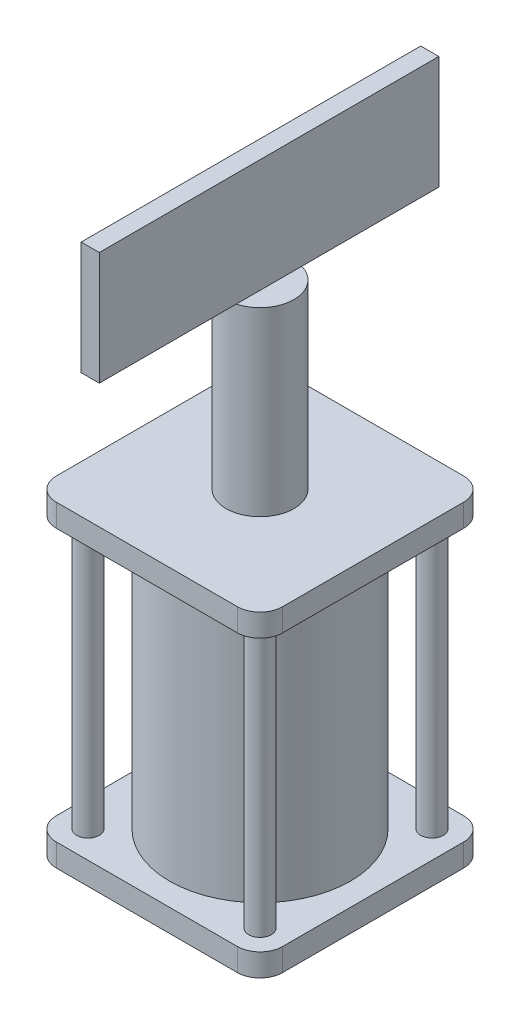
ISO-10303-21;
HEADER;
FILE_DESCRIPTION(('STEP AP214'),'2;1');
FILE_NAME('part.step','',(''),(''),'','','');
FILE_SCHEMA(('AUTOMOTIVE_DESIGN { 1 0 10303 214 1 1 1 1 }'));
ENDSEC;
DATA;
#1=APPLICATION_CONTEXT('core data for automotive mechanical design processes');
#2=APPLICATION_PROTOCOL_DEFINITION('international standard','automotive_design',2000,#1);
#3=PRODUCT_CONTEXT('',#1,'mechanical');
#4=PRODUCT('Part','Part','',(#3));
#5=PRODUCT_RELATED_PRODUCT_CATEGORY('part','',(#4));
#6=PRODUCT_DEFINITION_FORMATION('','',#4);
#7=PRODUCT_DEFINITION_CONTEXT('part definition',#1,'design');
#8=PRODUCT_DEFINITION('design','',#6,#7);
#9=PRODUCT_DEFINITION_SHAPE('','',#8);
#10=(LENGTH_UNIT() NAMED_UNIT(*) SI_UNIT(.MILLI.,.METRE.));
#11=(NAMED_UNIT(*) PLANE_ANGLE_UNIT() SI_UNIT($,.RADIAN.));
#12=(NAMED_UNIT(*) SI_UNIT($,.STERADIAN.) SOLID_ANGLE_UNIT());
#13=UNCERTAINTY_MEASURE_WITH_UNIT(LENGTH_MEASURE(1.E-05),#10,'distance_accuracy_value','');
#14=(GEOMETRIC_REPRESENTATION_CONTEXT(3) GLOBAL_UNCERTAINTY_ASSIGNED_CONTEXT((#13)) GLOBAL_UNIT_ASSIGNED_CONTEXT((#10,
#11,#12)) REPRESENTATION_CONTEXT('',''));
#15=CARTESIAN_POINT('',(0.,0.,0.));
#16=DIRECTION('',(0.,0.,1.));
#17=DIRECTION('',(1.,0.,0.));
#18=AXIS2_PLACEMENT_3D('',#15,#16,#17);
#19=CARTESIAN_POINT('',(4.,270.,75.));
#20=DIRECTION('',(-1.,0.,0.));
#21=DIRECTION('',(0.,0.,1.));
#22=AXIS2_PLACEMENT_3D('',#19,#20,#21);
#23=PLANE('',#22);
#24=DIRECTION('',(0.,0.,-1.));
#25=VECTOR('',#24,1.);
#26=CARTESIAN_POINT('',(4.,220.,75.));
#27=LINE('',#26,#25);
#28=CARTESIAN_POINT('',(4.,220.,75.));
#29=VERTEX_POINT('',#28);
#30=CARTESIAN_POINT('',(4.,220.,-75.));
#31=VERTEX_POINT('',#30);
#32=EDGE_CURVE('E108',#29,#31,#27,.T.);
#33=ORIENTED_EDGE('',*,*,#32,.T.);
#34=DIRECTION('',(0.,-1.,0.));
#35=VECTOR('',#34,1.);
#36=CARTESIAN_POINT('',(4.,270.,-75.));
#37=LINE('',#36,#35);
#38=CARTESIAN_POINT('',(4.,270.,-75.));
#39=VERTEX_POINT('',#38);
#40=EDGE_CURVE('E12',#39,#31,#37,.T.);
#41=ORIENTED_EDGE('',*,*,#40,.F.);
#42=DIRECTION('',(0.,0.,-1.));
#43=VECTOR('',#42,1.);
#44=CARTESIAN_POINT('',(4.,270.,75.));
#45=LINE('',#44,#43);
#46=CARTESIAN_POINT('',(4.,270.,75.));
#47=VERTEX_POINT('',#46);
#48=EDGE_CURVE('E96',#47,#39,#45,.T.);
#49=ORIENTED_EDGE('',*,*,#48,.F.);
#50=DIRECTION('',(0.,-1.,0.));
#51=VECTOR('',#50,1.);
#52=CARTESIAN_POINT('',(4.,270.,75.));
#53=LINE('',#52,#51);
#54=EDGE_CURVE('E104',#47,#29,#53,.T.);
#55=ORIENTED_EDGE('',*,*,#54,.T.);
#56=EDGE_LOOP('',(#33,#41,#49,#55));
#57=FACE_BOUND('',#56,.T.);
#58=ADVANCED_FACE('F45',(#57),#23,.F.);
#59=CARTESIAN_POINT('',(-4.,270.,-75.));
#60=DIRECTION('',(0.,0.,1.));
#61=DIRECTION('',(1.,0.,0.));
#62=AXIS2_PLACEMENT_3D('',#59,#60,#61);
#63=PLANE('',#62);
#64=DIRECTION('',(-1.,0.,0.));
#65=VECTOR('',#64,1.);
#66=CARTESIAN_POINT('',(-4.,220.,-75.));
#67=LINE('',#66,#65);
#68=CARTESIAN_POINT('',(-4.,220.,-75.));
#69=VERTEX_POINT('',#68);
#70=EDGE_CURVE('E100',#31,#69,#67,.T.);
#71=ORIENTED_EDGE('',*,*,#70,.T.);
#72=DIRECTION('',(0.,-1.,0.));
#73=VECTOR('',#72,1.);
#74=CARTESIAN_POINT('',(-4.,270.,-75.));
#75=LINE('',#74,#73);
#76=CARTESIAN_POINT('',(-4.,270.,-75.));
#77=VERTEX_POINT('',#76);
#78=EDGE_CURVE('E53',#77,#69,#75,.T.);
#79=ORIENTED_EDGE('',*,*,#78,.F.);
#80=DIRECTION('',(-1.,0.,0.));
#81=VECTOR('',#80,1.);
#82=CARTESIAN_POINT('',(-4.,270.,-75.));
#83=LINE('',#82,#81);
#84=EDGE_CURVE('E91',#39,#77,#83,.T.);
#85=ORIENTED_EDGE('',*,*,#84,.F.);
#86=ORIENTED_EDGE('',*,*,#40,.T.);
#87=EDGE_LOOP('',(#71,#79,#85,#86));
#88=FACE_BOUND('',#87,.T.);
#89=ADVANCED_FACE('F99',(#88),#63,.F.);
#90=CARTESIAN_POINT('',(-4.,270.,75.));
#91=DIRECTION('',(1.,0.,0.));
#92=DIRECTION('',(0.,0.,-1.));
#93=AXIS2_PLACEMENT_3D('',#90,#91,#92);
#94=PLANE('',#93);
#95=DIRECTION('',(0.,0.,1.));
#96=VECTOR('',#95,1.);
#97=CARTESIAN_POINT('',(-4.,220.,75.));
#98=LINE('',#97,#96);
#99=CARTESIAN_POINT('',(-4.,220.,75.));
#100=VERTEX_POINT('',#99);
#101=EDGE_CURVE('E78',#69,#100,#98,.T.);
#102=ORIENTED_EDGE('',*,*,#101,.T.);
#103=DIRECTION('',(0.,-1.,0.));
#104=VECTOR('',#103,1.);
#105=CARTESIAN_POINT('',(-4.,270.,75.));
#106=LINE('',#105,#104);
#107=CARTESIAN_POINT('',(-4.,270.,75.));
#108=VERTEX_POINT('',#107);
#109=EDGE_CURVE('E101',#108,#100,#106,.T.);
#110=ORIENTED_EDGE('',*,*,#109,.F.);
#111=DIRECTION('',(0.,0.,1.));
#112=VECTOR('',#111,1.);
#113=CARTESIAN_POINT('',(-4.,270.,75.));
#114=LINE('',#113,#112);
#115=EDGE_CURVE('E94',#77,#108,#114,.T.);
#116=ORIENTED_EDGE('',*,*,#115,.F.);
#117=ORIENTED_EDGE('',*,*,#78,.T.);
#118=EDGE_LOOP('',(#102,#110,#116,#117));
#119=FACE_BOUND('',#118,.T.);
#120=ADVANCED_FACE('F102',(#119),#94,.F.);
#121=CARTESIAN_POINT('',(-4.,270.,75.));
#122=DIRECTION('',(0.,0.,-1.));
#123=DIRECTION('',(-1.,0.,0.));
#124=AXIS2_PLACEMENT_3D('',#121,#122,#123);
#125=PLANE('',#124);
#126=DIRECTION('',(1.,0.,0.));
#127=VECTOR('',#126,1.);
#128=CARTESIAN_POINT('',(-4.,220.,75.));
#129=LINE('',#128,#127);
#130=EDGE_CURVE('E84',#100,#29,#129,.T.);
#131=ORIENTED_EDGE('',*,*,#130,.T.);
#132=ORIENTED_EDGE('',*,*,#54,.F.);
#133=DIRECTION('',(1.,0.,0.));
#134=VECTOR('',#133,1.);
#135=CARTESIAN_POINT('',(-4.,270.,75.));
#136=LINE('',#135,#134);
#137=EDGE_CURVE('E61',#108,#47,#136,.T.);
#138=ORIENTED_EDGE('',*,*,#137,.F.);
#139=ORIENTED_EDGE('',*,*,#109,.T.);
#140=EDGE_LOOP('',(#131,#132,#138,#139));
#141=FACE_BOUND('',#140,.T.);
#142=ADVANCED_FACE('F115',(#141),#125,.F.);
#143=CARTESIAN_POINT('',(0.,270.,0.));
#144=DIRECTION('',(0.,-1.,0.));
#145=DIRECTION('',(0.,0.,-1.));
#146=AXIS2_PLACEMENT_3D('',#143,#144,#145);
#147=PLANE('',#146);
#148=ORIENTED_EDGE('',*,*,#48,.T.);
#149=ORIENTED_EDGE('',*,*,#84,.T.);
#150=ORIENTED_EDGE('',*,*,#115,.T.);
#151=ORIENTED_EDGE('',*,*,#137,.T.);
#152=EDGE_LOOP('',(#148,#149,#150,#151));
#153=FACE_BOUND('',#152,.T.);
#154=ADVANCED_FACE('F92',(#153),#147,.F.);
#155=CARTESIAN_POINT('',(0.,220.,0.));
#156=DIRECTION('',(0.,-1.,0.));
#157=DIRECTION('',(0.,0.,-1.));
#158=AXIS2_PLACEMENT_3D('',#155,#156,#157);
#159=PLANE('',#158);
#160=ORIENTED_EDGE('',*,*,#32,.F.);
#161=ORIENTED_EDGE('',*,*,#130,.F.);
#162=ORIENTED_EDGE('',*,*,#101,.F.);
#163=ORIENTED_EDGE('',*,*,#70,.F.);
#164=EDGE_LOOP('',(#160,#161,#162,#163));
#165=FACE_BOUND('',#164,.T.);
#166=ADVANCED_FACE('F118',(#165),#159,.T.);
#167=CLOSED_SHELL('',(#58,#89,#120,#142,#154,#166));
#168=MANIFOLD_SOLID_BREP('B2',#167);
#169=CARTESIAN_POINT('',(0.,220.,0.));
#170=DIRECTION('',(0.,-1.,0.));
#171=DIRECTION('',(0.,0.,-1.));
#172=AXIS2_PLACEMENT_3D('',#169,#170,#171);
#173=CYLINDRICAL_SURFACE('',#172,15.);
#174=CARTESIAN_POINT('',(0.,220.,0.));
#175=DIRECTION('',(0.,1.,0.));
#176=DIRECTION('',(0.,0.,1.));
#177=AXIS2_PLACEMENT_3D('',#174,#175,#176);
#178=CIRCLE('',#177,15.);
#179=CARTESIAN_POINT('',(0.,220.,15.));
#180=VERTEX_POINT('',#179);
#181=EDGE_CURVE('E44',#180,#180,#178,.T.);
#182=ORIENTED_EDGE('',*,*,#181,.F.);
#183=EDGE_LOOP('',(#182));
#184=FACE_BOUND('',#183,.T.);
#185=CARTESIAN_POINT('',(0.,140.,0.));
#186=DIRECTION('',(0.,1.,0.));
#187=DIRECTION('',(0.,0.,1.));
#188=AXIS2_PLACEMENT_3D('',#185,#186,#187);
#189=CIRCLE('',#188,15.);
#190=CARTESIAN_POINT('',(0.,140.,15.));
#191=VERTEX_POINT('',#190);
#192=EDGE_CURVE('E180',#191,#191,#189,.T.);
#193=ORIENTED_EDGE('',*,*,#192,.T.);
#194=EDGE_LOOP('',(#193));
#195=FACE_BOUND('',#194,.T.);
#196=ADVANCED_FACE('F177',(#184,#195),#173,.T.);
#197=CARTESIAN_POINT('',(0.,220.,0.));
#198=DIRECTION('',(0.,1.,0.));
#199=DIRECTION('',(0.,0.,1.));
#200=AXIS2_PLACEMENT_3D('',#197,#198,#199);
#201=PLANE('',#200);
#202=ORIENTED_EDGE('',*,*,#181,.T.);
#203=EDGE_LOOP('',(#202));
#204=FACE_BOUND('',#203,.T.);
#205=ADVANCED_FACE('F192',(#204),#201,.T.);
#206=CARTESIAN_POINT('',(0.,140.,0.));
#207=DIRECTION('',(0.,1.,0.));
#208=DIRECTION('',(0.,0.,1.));
#209=AXIS2_PLACEMENT_3D('',#206,#207,#208);
#210=PLANE('',#209);
#211=ORIENTED_EDGE('',*,*,#192,.F.);
#212=EDGE_LOOP('',(#211));
#213=FACE_BOUND('',#212,.T.);
#214=ADVANCED_FACE('F190',(#213),#210,.F.);
#215=CLOSED_SHELL('',(#196,#205,#214));
#216=MANIFOLD_SOLID_BREP('B6',#215);
#217=CARTESIAN_POINT('',(50.,10.,50.));
#218=DIRECTION('',(-1.,0.,0.));
#219=DIRECTION('',(0.,0.,1.));
#220=AXIS2_PLACEMENT_3D('',#217,#218,#219);
#221=PLANE('',#220);
#222=DIRECTION('',(0.,0.,-1.));
#223=VECTOR('',#222,1.);
#224=CARTESIAN_POINT('',(50.,0.,50.));
#225=LINE('',#224,#223);
#226=CARTESIAN_POINT('',(50.,0.,40.));
#227=VERTEX_POINT('',#226);
#228=CARTESIAN_POINT('',(50.,0.,-40.));
#229=VERTEX_POINT('',#228);
#230=EDGE_CURVE('E358',#227,#229,#225,.T.);
#231=ORIENTED_EDGE('',*,*,#230,.T.);
#232=DIRECTION('',(0.,-1.,0.));
#233=VECTOR('',#232,1.);
#234=CARTESIAN_POINT('',(50.,10.,-40.));
#235=LINE('',#234,#233);
#236=CARTESIAN_POINT('',(50.,10.,-40.));
#237=VERTEX_POINT('',#236);
#238=EDGE_CURVE('E336',#229,#237,#235,.F.);
#239=ORIENTED_EDGE('',*,*,#238,.T.);
#240=DIRECTION('',(0.,0.,-1.));
#241=VECTOR('',#240,1.);
#242=CARTESIAN_POINT('',(50.,10.,50.));
#243=LINE('',#242,#241);
#244=CARTESIAN_POINT('',(50.,10.,40.));
#245=VERTEX_POINT('',#244);
#246=EDGE_CURVE('E369',#245,#237,#243,.T.);
#247=ORIENTED_EDGE('',*,*,#246,.F.);
#248=DIRECTION('',(0.,-1.,0.));
#249=VECTOR('',#248,1.);
#250=CARTESIAN_POINT('',(50.,10.,40.));
#251=LINE('',#250,#249);
#252=EDGE_CURVE('E341',#245,#227,#251,.T.);
#253=ORIENTED_EDGE('',*,*,#252,.T.);
#254=EDGE_LOOP('',(#231,#239,#247,#253));
#255=FACE_BOUND('',#254,.T.);
#256=ADVANCED_FACE('F217',(#255),#221,.F.);
#257=CARTESIAN_POINT('',(-50.,10.,-50.));
#258=DIRECTION('',(0.,0.,1.));
#259=DIRECTION('',(1.,0.,0.));
#260=AXIS2_PLACEMENT_3D('',#257,#258,#259);
#261=PLANE('',#260);
#262=DIRECTION('',(-1.,0.,0.));
#263=VECTOR('',#262,1.);
#264=CARTESIAN_POINT('',(-50.,10.,-50.));
#265=LINE('',#264,#263);
#266=CARTESIAN_POINT('',(40.,10.,-50.));
#267=VERTEX_POINT('',#266);
#268=CARTESIAN_POINT('',(-40.,10.,-50.));
#269=VERTEX_POINT('',#268);
#270=EDGE_CURVE('E351',#267,#269,#265,.T.);
#271=ORIENTED_EDGE('',*,*,#270,.F.);
#272=DIRECTION('',(0.,-1.,0.));
#273=VECTOR('',#272,1.);
#274=CARTESIAN_POINT('',(40.,10.,-50.));
#275=LINE('',#274,#273);
#276=CARTESIAN_POINT('',(40.,0.,-50.));
#277=VERTEX_POINT('',#276);
#278=EDGE_CURVE('E335',#267,#277,#275,.T.);
#279=ORIENTED_EDGE('',*,*,#278,.T.);
#280=DIRECTION('',(-1.,0.,0.));
#281=VECTOR('',#280,1.);
#282=CARTESIAN_POINT('',(-50.,0.,-50.));
#283=LINE('',#282,#281);
#284=CARTESIAN_POINT('',(-40.,0.,-50.));
#285=VERTEX_POINT('',#284);
#286=EDGE_CURVE('E348',#277,#285,#283,.T.);
#287=ORIENTED_EDGE('',*,*,#286,.T.);
#288=DIRECTION('',(0.,-1.,0.));
#289=VECTOR('',#288,1.);
#290=CARTESIAN_POINT('',(-40.,10.,-50.));
#291=LINE('',#290,#289);
#292=EDGE_CURVE('E353',#285,#269,#291,.F.);
#293=ORIENTED_EDGE('',*,*,#292,.T.);
#294=EDGE_LOOP('',(#271,#279,#287,#293));
#295=FACE_BOUND('',#294,.T.);
#296=ADVANCED_FACE('F347',(#295),#261,.F.);
#297=CARTESIAN_POINT('',(-50.,10.,50.));
#298=DIRECTION('',(1.,0.,0.));
#299=DIRECTION('',(0.,0.,-1.));
#300=AXIS2_PLACEMENT_3D('',#297,#298,#299);
#301=PLANE('',#300);
#302=DIRECTION('',(0.,0.,1.));
#303=VECTOR('',#302,1.);
#304=CARTESIAN_POINT('',(-50.,0.,50.));
#305=LINE('',#304,#303);
#306=CARTESIAN_POINT('',(-50.,0.,-40.));
#307=VERTEX_POINT('',#306);
#308=CARTESIAN_POINT('',(-50.,0.,40.));
#309=VERTEX_POINT('',#308);
#310=EDGE_CURVE('E357',#307,#309,#305,.T.);
#311=ORIENTED_EDGE('',*,*,#310,.T.);
#312=DIRECTION('',(0.,-1.,0.));
#313=VECTOR('',#312,1.);
#314=CARTESIAN_POINT('',(-50.,10.,40.));
#315=LINE('',#314,#313);
#316=CARTESIAN_POINT('',(-50.,10.,40.));
#317=VERTEX_POINT('',#316);
#318=EDGE_CURVE('E419',#309,#317,#315,.F.);
#319=ORIENTED_EDGE('',*,*,#318,.T.);
#320=DIRECTION('',(0.,0.,1.));
#321=VECTOR('',#320,1.);
#322=CARTESIAN_POINT('',(-50.,10.,50.));
#323=LINE('',#322,#321);
#324=CARTESIAN_POINT('',(-50.,10.,-40.));
#325=VERTEX_POINT('',#324);
#326=EDGE_CURVE('E486',#325,#317,#323,.T.);
#327=ORIENTED_EDGE('',*,*,#326,.F.);
#328=DIRECTION('',(0.,-1.,0.));
#329=VECTOR('',#328,1.);
#330=CARTESIAN_POINT('',(-50.,10.,-40.));
#331=LINE('',#330,#329);
#332=EDGE_CURVE('E416',#325,#307,#331,.T.);
#333=ORIENTED_EDGE('',*,*,#332,.T.);
#334=EDGE_LOOP('',(#311,#319,#327,#333));
#335=FACE_BOUND('',#334,.T.);
#336=ADVANCED_FACE('F508',(#335),#301,.F.);
#337=CARTESIAN_POINT('',(-50.,10.,50.));
#338=DIRECTION('',(0.,0.,-1.));
#339=DIRECTION('',(-1.,0.,0.));
#340=AXIS2_PLACEMENT_3D('',#337,#338,#339);
#341=PLANE('',#340);
#342=DIRECTION('',(1.,0.,0.));
#343=VECTOR('',#342,1.);
#344=CARTESIAN_POINT('',(-50.,0.,50.));
#345=LINE('',#344,#343);
#346=CARTESIAN_POINT('',(-40.,0.,50.));
#347=VERTEX_POINT('',#346);
#348=CARTESIAN_POINT('',(40.,0.,50.));
#349=VERTEX_POINT('',#348);
#350=EDGE_CURVE('E361',#347,#349,#345,.T.);
#351=ORIENTED_EDGE('',*,*,#350,.T.);
#352=DIRECTION('',(0.,-1.,0.));
#353=VECTOR('',#352,1.);
#354=CARTESIAN_POINT('',(40.,10.,50.));
#355=LINE('',#354,#353);
#356=CARTESIAN_POINT('',(40.,10.,50.));
#357=VERTEX_POINT('',#356);
#358=EDGE_CURVE('E414',#349,#357,#355,.F.);
#359=ORIENTED_EDGE('',*,*,#358,.T.);
#360=DIRECTION('',(1.,0.,0.));
#361=VECTOR('',#360,1.);
#362=CARTESIAN_POINT('',(-50.,10.,50.));
#363=LINE('',#362,#361);
#364=CARTESIAN_POINT('',(-40.,10.,50.));
#365=VERTEX_POINT('',#364);
#366=EDGE_CURVE('E374',#365,#357,#363,.T.);
#367=ORIENTED_EDGE('',*,*,#366,.F.);
#368=DIRECTION('',(0.,-1.,0.));
#369=VECTOR('',#368,1.);
#370=CARTESIAN_POINT('',(-40.,10.,50.));
#371=LINE('',#370,#369);
#372=EDGE_CURVE('E411',#365,#347,#371,.T.);
#373=ORIENTED_EDGE('',*,*,#372,.T.);
#374=EDGE_LOOP('',(#351,#359,#367,#373));
#375=FACE_BOUND('',#374,.T.);
#376=ADVANCED_FACE('F503',(#375),#341,.F.);
#377=CARTESIAN_POINT('',(0.,10.,0.));
#378=DIRECTION('',(0.,-1.,0.));
#379=DIRECTION('',(0.,0.,-1.));
#380=AXIS2_PLACEMENT_3D('',#377,#378,#379);
#381=PLANE('',#380);
#382=CARTESIAN_POINT('',(-38.,10.,38.));
#383=DIRECTION('',(0.,-1.,0.));
#384=DIRECTION('',(0.,0.,-1.));
#385=AXIS2_PLACEMENT_3D('',#382,#383,#384);
#386=CIRCLE('',#385,5.);
#387=CARTESIAN_POINT('',(-38.,10.,33.));
#388=VERTEX_POINT('',#387);
#389=EDGE_CURVE('E392',#388,#388,#386,.F.);
#390=ORIENTED_EDGE('',*,*,#389,.F.);
#391=EDGE_LOOP('',(#390));
#392=FACE_BOUND('',#391,.T.);
#393=CARTESIAN_POINT('',(38.,10.,38.));
#394=DIRECTION('',(0.,-1.,0.));
#395=DIRECTION('',(0.,0.,-1.));
#396=AXIS2_PLACEMENT_3D('',#393,#394,#395);
#397=CIRCLE('',#396,5.);
#398=CARTESIAN_POINT('',(38.,10.,33.));
#399=VERTEX_POINT('',#398);
#400=EDGE_CURVE('E386',#399,#399,#397,.F.);
#401=ORIENTED_EDGE('',*,*,#400,.F.);
#402=EDGE_LOOP('',(#401));
#403=FACE_BOUND('',#402,.T.);
#404=CARTESIAN_POINT('',(38.,10.,-38.));
#405=DIRECTION('',(0.,-1.,0.));
#406=DIRECTION('',(0.,0.,-1.));
#407=AXIS2_PLACEMENT_3D('',#404,#405,#406);
#408=CIRCLE('',#407,5.);
#409=CARTESIAN_POINT('',(38.,10.,-43.));
#410=VERTEX_POINT('',#409);
#411=EDGE_CURVE('E380',#410,#410,#408,.F.);
#412=ORIENTED_EDGE('',*,*,#411,.F.);
#413=EDGE_LOOP('',(#412));
#414=FACE_BOUND('',#413,.T.);
#415=CARTESIAN_POINT('',(0.,9.99999999999999,0.));
#416=DIRECTION('',(0.,-1.,0.));
#417=DIRECTION('',(0.,0.,-1.));
#418=AXIS2_PLACEMENT_3D('',#415,#416,#417);
#419=CIRCLE('',#418,40.);
#420=CARTESIAN_POINT('',(0.,9.99999999999999,-40.));
#421=VERTEX_POINT('',#420);
#422=EDGE_CURVE('E373',#421,#421,#419,.F.);
#423=ORIENTED_EDGE('',*,*,#422,.F.);
#424=EDGE_LOOP('',(#423));
#425=FACE_BOUND('',#424,.T.);
#426=CARTESIAN_POINT('',(-38.,10.,-38.));
#427=DIRECTION('',(0.,-1.,0.));
#428=DIRECTION('',(0.,0.,-1.));
#429=AXIS2_PLACEMENT_3D('',#426,#427,#428);
#430=CIRCLE('',#429,5.);
#431=CARTESIAN_POINT('',(-38.,10.,-43.));
#432=VERTEX_POINT('',#431);
#433=EDGE_CURVE('E370',#432,#432,#430,.F.);
#434=ORIENTED_EDGE('',*,*,#433,.F.);
#435=EDGE_LOOP('',(#434));
#436=FACE_BOUND('',#435,.T.);
#437=ORIENTED_EDGE('',*,*,#246,.T.);
#438=CARTESIAN_POINT('',(40.,10.,-40.));
#439=DIRECTION('',(0.,-1.,0.));
#440=DIRECTION('',(0.,0.,-1.));
#441=AXIS2_PLACEMENT_3D('',#438,#439,#440);
#442=CIRCLE('',#441,10.);
#443=EDGE_CURVE('E409',#237,#267,#442,.F.);
#444=ORIENTED_EDGE('',*,*,#443,.T.);
#445=ORIENTED_EDGE('',*,*,#270,.T.);
#446=CARTESIAN_POINT('',(-40.,10.,-40.));
#447=DIRECTION('',(0.,-1.,0.));
#448=DIRECTION('',(0.,0.,-1.));
#449=AXIS2_PLACEMENT_3D('',#446,#447,#448);
#450=CIRCLE('',#449,10.);
#451=EDGE_CURVE('E403',#269,#325,#450,.F.);
#452=ORIENTED_EDGE('',*,*,#451,.T.);
#453=ORIENTED_EDGE('',*,*,#326,.T.);
#454=CARTESIAN_POINT('',(-40.,10.,40.));
#455=DIRECTION('',(0.,-1.,0.));
#456=DIRECTION('',(0.,0.,-1.));
#457=AXIS2_PLACEMENT_3D('',#454,#455,#456);
#458=CIRCLE('',#457,10.);
#459=EDGE_CURVE('E405',#317,#365,#458,.F.);
#460=ORIENTED_EDGE('',*,*,#459,.T.);
#461=ORIENTED_EDGE('',*,*,#366,.T.);
#462=CARTESIAN_POINT('',(40.,10.,40.));
#463=DIRECTION('',(0.,-1.,0.));
#464=DIRECTION('',(0.,0.,-1.));
#465=AXIS2_PLACEMENT_3D('',#462,#463,#464);
#466=CIRCLE('',#465,10.);
#467=EDGE_CURVE('E407',#357,#245,#466,.F.);
#468=ORIENTED_EDGE('',*,*,#467,.T.);
#469=EDGE_LOOP('',(#437,#444,#445,#452,#453,#460,#461,#468));
#470=FACE_BOUND('',#469,.T.);
#471=ADVANCED_FACE('F492',(#392,#403,#414,#425,#436,#470),#381,.F.);
#472=CARTESIAN_POINT('',(0.,0.,0.));
#473=DIRECTION('',(0.,-1.,0.));
#474=DIRECTION('',(0.,0.,-1.));
#475=AXIS2_PLACEMENT_3D('',#472,#473,#474);
#476=PLANE('',#475);
#477=ORIENTED_EDGE('',*,*,#286,.F.);
#478=CARTESIAN_POINT('',(40.,0.,-40.));
#479=DIRECTION('',(0.,-1.,0.));
#480=DIRECTION('',(0.,0.,-1.));
#481=AXIS2_PLACEMENT_3D('',#478,#479,#480);
#482=CIRCLE('',#481,10.);
#483=EDGE_CURVE('E331',#277,#229,#482,.T.);
#484=ORIENTED_EDGE('',*,*,#483,.T.);
#485=ORIENTED_EDGE('',*,*,#230,.F.);
#486=CARTESIAN_POINT('',(40.,0.,40.));
#487=DIRECTION('',(0.,-1.,0.));
#488=DIRECTION('',(0.,0.,-1.));
#489=AXIS2_PLACEMENT_3D('',#486,#487,#488);
#490=CIRCLE('',#489,10.);
#491=EDGE_CURVE('E342',#227,#349,#490,.T.);
#492=ORIENTED_EDGE('',*,*,#491,.T.);
#493=ORIENTED_EDGE('',*,*,#350,.F.);
#494=CARTESIAN_POINT('',(-40.,0.,40.));
#495=DIRECTION('',(0.,-1.,0.));
#496=DIRECTION('',(0.,0.,-1.));
#497=AXIS2_PLACEMENT_3D('',#494,#495,#496);
#498=CIRCLE('',#497,10.);
#499=EDGE_CURVE('E397',#347,#309,#498,.T.);
#500=ORIENTED_EDGE('',*,*,#499,.T.);
#501=ORIENTED_EDGE('',*,*,#310,.F.);
#502=CARTESIAN_POINT('',(-40.,0.,-40.));
#503=DIRECTION('',(0.,-1.,0.));
#504=DIRECTION('',(0.,0.,-1.));
#505=AXIS2_PLACEMENT_3D('',#502,#503,#504);
#506=CIRCLE('',#505,10.);
#507=EDGE_CURVE('E352',#307,#285,#506,.T.);
#508=ORIENTED_EDGE('',*,*,#507,.T.);
#509=EDGE_LOOP('',(#477,#484,#485,#492,#493,#500,#501,#508));
#510=FACE_BOUND('',#509,.T.);
#511=ADVANCED_FACE('F355',(#510),#476,.T.);
#512=CARTESIAN_POINT('',(-38.,144.142135623731,-38.));
#513=DIRECTION('',(0.,-1.,0.));
#514=DIRECTION('',(0.,0.,-1.));
#515=AXIS2_PLACEMENT_3D('',#512,#513,#514);
#516=CYLINDRICAL_SURFACE('',#515,5.);
#517=ORIENTED_EDGE('',*,*,#433,.T.);
#518=EDGE_LOOP('',(#517));
#519=FACE_BOUND('',#518,.T.);
#520=CARTESIAN_POINT('',(-38.,130.,-38.));
#521=DIRECTION('',(0.,1.,0.));
#522=DIRECTION('',(0.,0.,1.));
#523=AXIS2_PLACEMENT_3D('',#520,#521,#522);
#524=CIRCLE('',#523,5.);
#525=CARTESIAN_POINT('',(-38.,130.,-33.));
#526=VERTEX_POINT('',#525);
#527=EDGE_CURVE('E363',#526,#526,#524,.T.);
#528=ORIENTED_EDGE('',*,*,#527,.F.);
#529=EDGE_LOOP('',(#528));
#530=FACE_BOUND('',#529,.T.);
#531=ADVANCED_FACE('F622',(#519,#530),#516,.T.);
#532=CARTESIAN_POINT('',(0.,130.,0.));
#533=DIRECTION('',(0.,-1.,0.));
#534=DIRECTION('',(0.,0.,-1.));
#535=AXIS2_PLACEMENT_3D('',#532,#533,#534);
#536=CYLINDRICAL_SURFACE('',#535,40.);
#537=CARTESIAN_POINT('',(0.,130.,0.));
#538=DIRECTION('',(0.,1.,0.));
#539=DIRECTION('',(0.,0.,1.));
#540=AXIS2_PLACEMENT_3D('',#537,#538,#539);
#541=CIRCLE('',#540,40.);
#542=CARTESIAN_POINT('',(0.,130.,40.));
#543=VERTEX_POINT('',#542);
#544=EDGE_CURVE('E477',#543,#543,#541,.T.);
#545=ORIENTED_EDGE('',*,*,#544,.F.);
#546=EDGE_LOOP('',(#545));
#547=FACE_BOUND('',#546,.T.);
#548=ORIENTED_EDGE('',*,*,#422,.T.);
#549=EDGE_LOOP('',(#548));
#550=FACE_BOUND('',#549,.T.);
#551=ADVANCED_FACE('F619',(#547,#550),#536,.T.);
#552=CARTESIAN_POINT('',(-50.,140.,-50.));
#553=DIRECTION('',(1.,0.,0.));
#554=DIRECTION('',(0.,0.,-1.));
#555=AXIS2_PLACEMENT_3D('',#552,#553,#554);
#556=PLANE('',#555);
#557=DIRECTION('',(0.,0.,1.));
#558=VECTOR('',#557,1.);
#559=CARTESIAN_POINT('',(-50.,140.,-50.));
#560=LINE('',#559,#558);
#561=CARTESIAN_POINT('',(-50.,140.,-40.));
#562=VERTEX_POINT('',#561);
#563=CARTESIAN_POINT('',(-50.,140.,40.));
#564=VERTEX_POINT('',#563);
#565=EDGE_CURVE('E476',#562,#564,#560,.T.);
#566=ORIENTED_EDGE('',*,*,#565,.F.);
#567=DIRECTION('',(0.,-1.,0.));
#568=VECTOR('',#567,1.);
#569=CARTESIAN_POINT('',(-50.,140.,-40.));
#570=LINE('',#569,#568);
#571=CARTESIAN_POINT('',(-50.,130.,-40.));
#572=VERTEX_POINT('',#571);
#573=EDGE_CURVE('E423',#562,#572,#570,.T.);
#574=ORIENTED_EDGE('',*,*,#573,.T.);
#575=DIRECTION('',(0.,0.,1.));
#576=VECTOR('',#575,1.);
#577=CARTESIAN_POINT('',(-50.,130.,-50.));
#578=LINE('',#577,#576);
#579=CARTESIAN_POINT('',(-50.,130.,40.));
#580=VERTEX_POINT('',#579);
#581=EDGE_CURVE('E467',#572,#580,#578,.T.);
#582=ORIENTED_EDGE('',*,*,#581,.T.);
#583=DIRECTION('',(0.,-1.,0.));
#584=VECTOR('',#583,1.);
#585=CARTESIAN_POINT('',(-50.,140.,40.));
#586=LINE('',#585,#584);
#587=EDGE_CURVE('E421',#580,#564,#586,.F.);
#588=ORIENTED_EDGE('',*,*,#587,.T.);
#589=EDGE_LOOP('',(#566,#574,#582,#588));
#590=FACE_BOUND('',#589,.T.);
#591=ADVANCED_FACE('F602',(#590),#556,.F.);
#592=CARTESIAN_POINT('',(-50.,140.,50.));
#593=DIRECTION('',(0.,0.,-1.));
#594=DIRECTION('',(-1.,0.,0.));
#595=AXIS2_PLACEMENT_3D('',#592,#593,#594);
#596=PLANE('',#595);
#597=DIRECTION('',(1.,0.,0.));
#598=VECTOR('',#597,1.);
#599=CARTESIAN_POINT('',(-50.,130.,50.));
#600=LINE('',#599,#598);
#601=CARTESIAN_POINT('',(-40.,130.,50.));
#602=VERTEX_POINT('',#601);
#603=CARTESIAN_POINT('',(40.,130.,50.));
#604=VERTEX_POINT('',#603);
#605=EDGE_CURVE('E456',#602,#604,#600,.T.);
#606=ORIENTED_EDGE('',*,*,#605,.T.);
#607=DIRECTION('',(0.,-1.,0.));
#608=VECTOR('',#607,1.);
#609=CARTESIAN_POINT('',(40.,140.,50.));
#610=LINE('',#609,#608);
#611=CARTESIAN_POINT('',(40.,140.,50.));
#612=VERTEX_POINT('',#611);
#613=EDGE_CURVE('E175',#604,#612,#610,.F.);
#614=ORIENTED_EDGE('',*,*,#613,.T.);
#615=DIRECTION('',(1.,0.,0.));
#616=VECTOR('',#615,1.);
#617=CARTESIAN_POINT('',(-50.,140.,50.));
#618=LINE('',#617,#616);
#619=CARTESIAN_POINT('',(-40.,140.,50.));
#620=VERTEX_POINT('',#619);
#621=EDGE_CURVE('E458',#620,#612,#618,.T.);
#622=ORIENTED_EDGE('',*,*,#621,.F.);
#623=DIRECTION('',(0.,-1.,0.));
#624=VECTOR('',#623,1.);
#625=CARTESIAN_POINT('',(-40.,140.,50.));
#626=LINE('',#625,#624);
#627=EDGE_CURVE('E225',#620,#602,#626,.T.);
#628=ORIENTED_EDGE('',*,*,#627,.T.);
#629=EDGE_LOOP('',(#606,#614,#622,#628));
#630=FACE_BOUND('',#629,.T.);
#631=ADVANCED_FACE('F455',(#630),#596,.F.);
#632=CARTESIAN_POINT('',(50.,140.,-50.));
#633=DIRECTION('',(-1.,0.,0.));
#634=DIRECTION('',(0.,0.,1.));
#635=AXIS2_PLACEMENT_3D('',#632,#633,#634);
#636=PLANE('',#635);
#637=DIRECTION('',(0.,0.,-1.));
#638=VECTOR('',#637,1.);
#639=CARTESIAN_POINT('',(50.,130.,-50.));
#640=LINE('',#639,#638);
#641=CARTESIAN_POINT('',(50.,130.,40.));
#642=VERTEX_POINT('',#641);
#643=CARTESIAN_POINT('',(50.,130.,-40.));
#644=VERTEX_POINT('',#643);
#645=EDGE_CURVE('E466',#642,#644,#640,.T.);
#646=ORIENTED_EDGE('',*,*,#645,.T.);
#647=DIRECTION('',(0.,-1.,0.));
#648=VECTOR('',#647,1.);
#649=CARTESIAN_POINT('',(50.,140.,-40.));
#650=LINE('',#649,#648);
#651=CARTESIAN_POINT('',(50.,140.,-40.));
#652=VERTEX_POINT('',#651);
#653=EDGE_CURVE('E232',#644,#652,#650,.F.);
#654=ORIENTED_EDGE('',*,*,#653,.T.);
#655=DIRECTION('',(0.,0.,-1.));
#656=VECTOR('',#655,1.);
#657=CARTESIAN_POINT('',(50.,140.,-50.));
#658=LINE('',#657,#656);
#659=CARTESIAN_POINT('',(50.,140.,40.));
#660=VERTEX_POINT('',#659);
#661=EDGE_CURVE('E594',#660,#652,#658,.T.);
#662=ORIENTED_EDGE('',*,*,#661,.F.);
#663=DIRECTION('',(0.,-1.,0.));
#664=VECTOR('',#663,1.);
#665=CARTESIAN_POINT('',(50.,140.,40.));
#666=LINE('',#665,#664);
#667=EDGE_CURVE('E446',#660,#642,#666,.T.);
#668=ORIENTED_EDGE('',*,*,#667,.T.);
#669=EDGE_LOOP('',(#646,#654,#662,#668));
#670=FACE_BOUND('',#669,.T.);
#671=ADVANCED_FACE('F605',(#670),#636,.F.);
#672=CARTESIAN_POINT('',(-50.,140.,-50.));
#673=DIRECTION('',(0.,0.,1.));
#674=DIRECTION('',(1.,0.,0.));
#675=AXIS2_PLACEMENT_3D('',#672,#673,#674);
#676=PLANE('',#675);
#677=DIRECTION('',(-1.,0.,0.));
#678=VECTOR('',#677,1.);
#679=CARTESIAN_POINT('',(-50.,130.,-50.));
#680=LINE('',#679,#678);
#681=CARTESIAN_POINT('',(40.,130.,-50.));
#682=VERTEX_POINT('',#681);
#683=CARTESIAN_POINT('',(-40.,130.,-50.));
#684=VERTEX_POINT('',#683);
#685=EDGE_CURVE('E469',#682,#684,#680,.T.);
#686=ORIENTED_EDGE('',*,*,#685,.T.);
#687=DIRECTION('',(0.,-1.,0.));
#688=VECTOR('',#687,1.);
#689=CARTESIAN_POINT('',(-40.,140.,-50.));
#690=LINE('',#689,#688);
#691=CARTESIAN_POINT('',(-40.,140.,-50.));
#692=VERTEX_POINT('',#691);
#693=EDGE_CURVE('E437',#684,#692,#690,.F.);
#694=ORIENTED_EDGE('',*,*,#693,.T.);
#695=DIRECTION('',(-1.,0.,0.));
#696=VECTOR('',#695,1.);
#697=CARTESIAN_POINT('',(-50.,140.,-50.));
#698=LINE('',#697,#696);
#699=CARTESIAN_POINT('',(40.,140.,-50.));
#700=VERTEX_POINT('',#699);
#701=EDGE_CURVE('E480',#700,#692,#698,.T.);
#702=ORIENTED_EDGE('',*,*,#701,.F.);
#703=DIRECTION('',(0.,-1.,0.));
#704=VECTOR('',#703,1.);
#705=CARTESIAN_POINT('',(40.,140.,-50.));
#706=LINE('',#705,#704);
#707=EDGE_CURVE('E434',#700,#682,#706,.T.);
#708=ORIENTED_EDGE('',*,*,#707,.T.);
#709=EDGE_LOOP('',(#686,#694,#702,#708));
#710=FACE_BOUND('',#709,.T.);
#711=ADVANCED_FACE('F604',(#710),#676,.F.);
#712=CARTESIAN_POINT('',(0.,140.,0.));
#713=DIRECTION('',(0.,1.,0.));
#714=DIRECTION('',(0.,0.,1.));
#715=AXIS2_PLACEMENT_3D('',#712,#713,#714);
#716=PLANE('',#715);
#717=ORIENTED_EDGE('',*,*,#701,.T.);
#718=CARTESIAN_POINT('',(-40.,140.,-40.));
#719=DIRECTION('',(0.,1.,0.));
#720=DIRECTION('',(0.,0.,1.));
#721=AXIS2_PLACEMENT_3D('',#718,#719,#720);
#722=CIRCLE('',#721,10.);
#723=EDGE_CURVE('E444',#692,#562,#722,.T.);
#724=ORIENTED_EDGE('',*,*,#723,.T.);
#725=ORIENTED_EDGE('',*,*,#565,.T.);
#726=CARTESIAN_POINT('',(-40.,140.,40.));
#727=DIRECTION('',(0.,1.,0.));
#728=DIRECTION('',(0.,0.,1.));
#729=AXIS2_PLACEMENT_3D('',#726,#727,#728);
#730=CIRCLE('',#729,10.);
#731=EDGE_CURVE('E439',#564,#620,#730,.T.);
#732=ORIENTED_EDGE('',*,*,#731,.T.);
#733=ORIENTED_EDGE('',*,*,#621,.T.);
#734=CARTESIAN_POINT('',(40.,140.,40.));
#735=DIRECTION('',(0.,1.,0.));
#736=DIRECTION('',(0.,0.,1.));
#737=AXIS2_PLACEMENT_3D('',#734,#735,#736);
#738=CIRCLE('',#737,10.);
#739=EDGE_CURVE('E239',#612,#660,#738,.T.);
#740=ORIENTED_EDGE('',*,*,#739,.T.);
#741=ORIENTED_EDGE('',*,*,#661,.T.);
#742=CARTESIAN_POINT('',(40.,140.,-40.));
#743=DIRECTION('',(0.,1.,0.));
#744=DIRECTION('',(0.,0.,1.));
#745=AXIS2_PLACEMENT_3D('',#742,#743,#744);
#746=CIRCLE('',#745,10.);
#747=EDGE_CURVE('E442',#652,#700,#746,.T.);
#748=ORIENTED_EDGE('',*,*,#747,.T.);
#749=EDGE_LOOP('',(#717,#724,#725,#732,#733,#740,#741,#748));
#750=FACE_BOUND('',#749,.T.);
#751=ADVANCED_FACE('F588',(#750),#716,.T.);
#752=CARTESIAN_POINT('',(0.,130.,0.));
#753=DIRECTION('',(0.,1.,0.));
#754=DIRECTION('',(0.,0.,1.));
#755=AXIS2_PLACEMENT_3D('',#752,#753,#754);
#756=PLANE('',#755);
#757=CARTESIAN_POINT('',(-38.,130.,38.));
#758=DIRECTION('',(0.,1.,0.));
#759=DIRECTION('',(0.,0.,1.));
#760=AXIS2_PLACEMENT_3D('',#757,#758,#759);
#761=CIRCLE('',#760,5.);
#762=CARTESIAN_POINT('',(-38.,130.,43.));
#763=VERTEX_POINT('',#762);
#764=EDGE_CURVE('E389',#763,#763,#761,.F.);
#765=ORIENTED_EDGE('',*,*,#764,.F.);
#766=EDGE_LOOP('',(#765));
#767=FACE_BOUND('',#766,.T.);
#768=CARTESIAN_POINT('',(38.,130.,38.));
#769=DIRECTION('',(0.,1.,0.));
#770=DIRECTION('',(0.,0.,1.));
#771=AXIS2_PLACEMENT_3D('',#768,#769,#770);
#772=CIRCLE('',#771,5.);
#773=CARTESIAN_POINT('',(38.,130.,43.));
#774=VERTEX_POINT('',#773);
#775=EDGE_CURVE('E383',#774,#774,#772,.F.);
#776=ORIENTED_EDGE('',*,*,#775,.F.);
#777=EDGE_LOOP('',(#776));
#778=FACE_BOUND('',#777,.T.);
#779=CARTESIAN_POINT('',(38.,130.,-38.));
#780=DIRECTION('',(0.,1.,0.));
#781=DIRECTION('',(0.,0.,1.));
#782=AXIS2_PLACEMENT_3D('',#779,#780,#781);
#783=CIRCLE('',#782,5.);
#784=CARTESIAN_POINT('',(38.,130.,-33.));
#785=VERTEX_POINT('',#784);
#786=EDGE_CURVE('E377',#785,#785,#783,.F.);
#787=ORIENTED_EDGE('',*,*,#786,.F.);
#788=EDGE_LOOP('',(#787));
#789=FACE_BOUND('',#788,.T.);
#790=ORIENTED_EDGE('',*,*,#527,.T.);
#791=EDGE_LOOP('',(#790));
#792=FACE_BOUND('',#791,.T.);
#793=ORIENTED_EDGE('',*,*,#544,.T.);
#794=EDGE_LOOP('',(#793));
#795=FACE_BOUND('',#794,.T.);
#796=ORIENTED_EDGE('',*,*,#581,.F.);
#797=CARTESIAN_POINT('',(-40.,130.,-40.));
#798=DIRECTION('',(0.,1.,0.));
#799=DIRECTION('',(0.,0.,1.));
#800=AXIS2_PLACEMENT_3D('',#797,#798,#799);
#801=CIRCLE('',#800,10.);
#802=EDGE_CURVE('E432',#572,#684,#801,.F.);
#803=ORIENTED_EDGE('',*,*,#802,.T.);
#804=ORIENTED_EDGE('',*,*,#685,.F.);
#805=CARTESIAN_POINT('',(40.,130.,-40.));
#806=DIRECTION('',(0.,1.,0.));
#807=DIRECTION('',(0.,0.,1.));
#808=AXIS2_PLACEMENT_3D('',#805,#806,#807);
#809=CIRCLE('',#808,10.);
#810=EDGE_CURVE('E430',#682,#644,#809,.F.);
#811=ORIENTED_EDGE('',*,*,#810,.T.);
#812=ORIENTED_EDGE('',*,*,#645,.F.);
#813=CARTESIAN_POINT('',(40.,130.,40.));
#814=DIRECTION('',(0.,1.,0.));
#815=DIRECTION('',(0.,0.,1.));
#816=AXIS2_PLACEMENT_3D('',#813,#814,#815);
#817=CIRCLE('',#816,10.);
#818=EDGE_CURVE('E428',#642,#604,#817,.F.);
#819=ORIENTED_EDGE('',*,*,#818,.T.);
#820=ORIENTED_EDGE('',*,*,#605,.F.);
#821=CARTESIAN_POINT('',(-40.,130.,40.));
#822=DIRECTION('',(0.,1.,0.));
#823=DIRECTION('',(0.,0.,1.));
#824=AXIS2_PLACEMENT_3D('',#821,#822,#823);
#825=CIRCLE('',#824,10.);
#826=EDGE_CURVE('E426',#602,#580,#825,.F.);
#827=ORIENTED_EDGE('',*,*,#826,.T.);
#828=EDGE_LOOP('',(#796,#803,#804,#811,#812,#819,#820,#827));
#829=FACE_BOUND('',#828,.T.);
#830=ADVANCED_FACE('F463',(#767,#778,#789,#792,#795,#829),#756,.F.);
#831=CARTESIAN_POINT('',(38.,144.142135623731,-38.));
#832=DIRECTION('',(0.,-1.,0.));
#833=DIRECTION('',(0.,0.,-1.));
#834=AXIS2_PLACEMENT_3D('',#831,#832,#833);
#835=CYLINDRICAL_SURFACE('',#834,5.);
#836=ORIENTED_EDGE('',*,*,#411,.T.);
#837=EDGE_LOOP('',(#836));
#838=FACE_BOUND('',#837,.T.);
#839=ORIENTED_EDGE('',*,*,#786,.T.);
#840=EDGE_LOOP('',(#839));
#841=FACE_BOUND('',#840,.T.);
#842=ADVANCED_FACE('F693',(#838,#841),#835,.T.);
#843=CARTESIAN_POINT('',(38.,144.142135623731,38.));
#844=DIRECTION('',(0.,-1.,0.));
#845=DIRECTION('',(0.,0.,-1.));
#846=AXIS2_PLACEMENT_3D('',#843,#844,#845);
#847=CYLINDRICAL_SURFACE('',#846,5.);
#848=ORIENTED_EDGE('',*,*,#400,.T.);
#849=EDGE_LOOP('',(#848));
#850=FACE_BOUND('',#849,.T.);
#851=ORIENTED_EDGE('',*,*,#775,.T.);
#852=EDGE_LOOP('',(#851));
#853=FACE_BOUND('',#852,.T.);
#854=ADVANCED_FACE('F710',(#850,#853),#847,.T.);
#855=CARTESIAN_POINT('',(-38.,144.142135623731,38.));
#856=DIRECTION('',(0.,-1.,0.));
#857=DIRECTION('',(0.,0.,-1.));
#858=AXIS2_PLACEMENT_3D('',#855,#856,#857);
#859=CYLINDRICAL_SURFACE('',#858,5.);
#860=ORIENTED_EDGE('',*,*,#389,.T.);
#861=EDGE_LOOP('',(#860));
#862=FACE_BOUND('',#861,.T.);
#863=ORIENTED_EDGE('',*,*,#764,.T.);
#864=EDGE_LOOP('',(#863));
#865=FACE_BOUND('',#864,.T.);
#866=ADVANCED_FACE('F535',(#862,#865),#859,.T.);
#867=CARTESIAN_POINT('',(40.,10.,-40.));
#868=DIRECTION('',(0.,-1.,0.));
#869=DIRECTION('',(0.,0.,-1.));
#870=AXIS2_PLACEMENT_3D('',#867,#868,#869);
#871=CYLINDRICAL_SURFACE('',#870,10.);
#872=ORIENTED_EDGE('',*,*,#443,.F.);
#873=ORIENTED_EDGE('',*,*,#238,.F.);
#874=ORIENTED_EDGE('',*,*,#483,.F.);
#875=ORIENTED_EDGE('',*,*,#278,.F.);
#876=EDGE_LOOP('',(#872,#873,#874,#875));
#877=FACE_BOUND('',#876,.T.);
#878=ADVANCED_FACE('F334',(#877),#871,.T.);
#879=CARTESIAN_POINT('',(40.,10.,40.));
#880=DIRECTION('',(0.,-1.,0.));
#881=DIRECTION('',(0.,0.,-1.));
#882=AXIS2_PLACEMENT_3D('',#879,#880,#881);
#883=CYLINDRICAL_SURFACE('',#882,10.);
#884=ORIENTED_EDGE('',*,*,#467,.F.);
#885=ORIENTED_EDGE('',*,*,#358,.F.);
#886=ORIENTED_EDGE('',*,*,#491,.F.);
#887=ORIENTED_EDGE('',*,*,#252,.F.);
#888=EDGE_LOOP('',(#884,#885,#886,#887));
#889=FACE_BOUND('',#888,.T.);
#890=ADVANCED_FACE('F500',(#889),#883,.T.);
#891=CARTESIAN_POINT('',(-40.,10.,40.));
#892=DIRECTION('',(0.,-1.,0.));
#893=DIRECTION('',(0.,0.,-1.));
#894=AXIS2_PLACEMENT_3D('',#891,#892,#893);
#895=CYLINDRICAL_SURFACE('',#894,10.);
#896=ORIENTED_EDGE('',*,*,#459,.F.);
#897=ORIENTED_EDGE('',*,*,#318,.F.);
#898=ORIENTED_EDGE('',*,*,#499,.F.);
#899=ORIENTED_EDGE('',*,*,#372,.F.);
#900=EDGE_LOOP('',(#896,#897,#898,#899));
#901=FACE_BOUND('',#900,.T.);
#902=ADVANCED_FACE('F505',(#901),#895,.T.);
#903=CARTESIAN_POINT('',(-40.,10.,-40.));
#904=DIRECTION('',(0.,-1.,0.));
#905=DIRECTION('',(0.,0.,-1.));
#906=AXIS2_PLACEMENT_3D('',#903,#904,#905);
#907=CYLINDRICAL_SURFACE('',#906,10.);
#908=ORIENTED_EDGE('',*,*,#451,.F.);
#909=ORIENTED_EDGE('',*,*,#292,.F.);
#910=ORIENTED_EDGE('',*,*,#507,.F.);
#911=ORIENTED_EDGE('',*,*,#332,.F.);
#912=EDGE_LOOP('',(#908,#909,#910,#911));
#913=FACE_BOUND('',#912,.T.);
#914=ADVANCED_FACE('F513',(#913),#907,.T.);
#915=CARTESIAN_POINT('',(-40.,140.,-40.));
#916=DIRECTION('',(0.,-1.,0.));
#917=DIRECTION('',(0.,0.,-1.));
#918=AXIS2_PLACEMENT_3D('',#915,#916,#917);
#919=CYLINDRICAL_SURFACE('',#918,10.);
#920=ORIENTED_EDGE('',*,*,#723,.F.);
#921=ORIENTED_EDGE('',*,*,#693,.F.);
#922=ORIENTED_EDGE('',*,*,#802,.F.);
#923=ORIENTED_EDGE('',*,*,#573,.F.);
#924=EDGE_LOOP('',(#920,#921,#922,#923));
#925=FACE_BOUND('',#924,.T.);
#926=ADVANCED_FACE('F515',(#925),#919,.T.);
#927=CARTESIAN_POINT('',(40.,140.,-40.));
#928=DIRECTION('',(0.,-1.,0.));
#929=DIRECTION('',(0.,0.,-1.));
#930=AXIS2_PLACEMENT_3D('',#927,#928,#929);
#931=CYLINDRICAL_SURFACE('',#930,10.);
#932=ORIENTED_EDGE('',*,*,#747,.F.);
#933=ORIENTED_EDGE('',*,*,#653,.F.);
#934=ORIENTED_EDGE('',*,*,#810,.F.);
#935=ORIENTED_EDGE('',*,*,#707,.F.);
#936=EDGE_LOOP('',(#932,#933,#934,#935));
#937=FACE_BOUND('',#936,.T.);
#938=ADVANCED_FACE('F521',(#937),#931,.T.);
#939=CARTESIAN_POINT('',(40.,140.,40.));
#940=DIRECTION('',(0.,-1.,0.));
#941=DIRECTION('',(0.,0.,-1.));
#942=AXIS2_PLACEMENT_3D('',#939,#940,#941);
#943=CYLINDRICAL_SURFACE('',#942,10.);
#944=ORIENTED_EDGE('',*,*,#739,.F.);
#945=ORIENTED_EDGE('',*,*,#613,.F.);
#946=ORIENTED_EDGE('',*,*,#818,.F.);
#947=ORIENTED_EDGE('',*,*,#667,.F.);
#948=EDGE_LOOP('',(#944,#945,#946,#947));
#949=FACE_BOUND('',#948,.T.);
#950=ADVANCED_FACE('F565',(#949),#943,.T.);
#951=CARTESIAN_POINT('',(-40.,140.,40.));
#952=DIRECTION('',(0.,-1.,0.));
#953=DIRECTION('',(0.,0.,-1.));
#954=AXIS2_PLACEMENT_3D('',#951,#952,#953);
#955=CYLINDRICAL_SURFACE('',#954,10.);
#956=ORIENTED_EDGE('',*,*,#731,.F.);
#957=ORIENTED_EDGE('',*,*,#587,.F.);
#958=ORIENTED_EDGE('',*,*,#826,.F.);
#959=ORIENTED_EDGE('',*,*,#627,.F.);
#960=EDGE_LOOP('',(#956,#957,#958,#959));
#961=FACE_BOUND('',#960,.T.);
#962=ADVANCED_FACE('F219',(#961),#955,.T.);
#963=CLOSED_SHELL('',(#256,#296,#336,#376,#471,#511,#531,#551,#591,#631,#671,#711,#751,#830,
#842,#854,#866,#878,#890,#902,#914,#926,#938,#950,#962));
#964=MANIFOLD_SOLID_BREP('B39',#963);
#965=ADVANCED_BREP_SHAPE_REPRESENTATION('',(#18,#168,#216,#964),#14);
#966=SHAPE_DEFINITION_REPRESENTATION(#9,#965);
ENDSEC;
END-ISO-10303-21;
